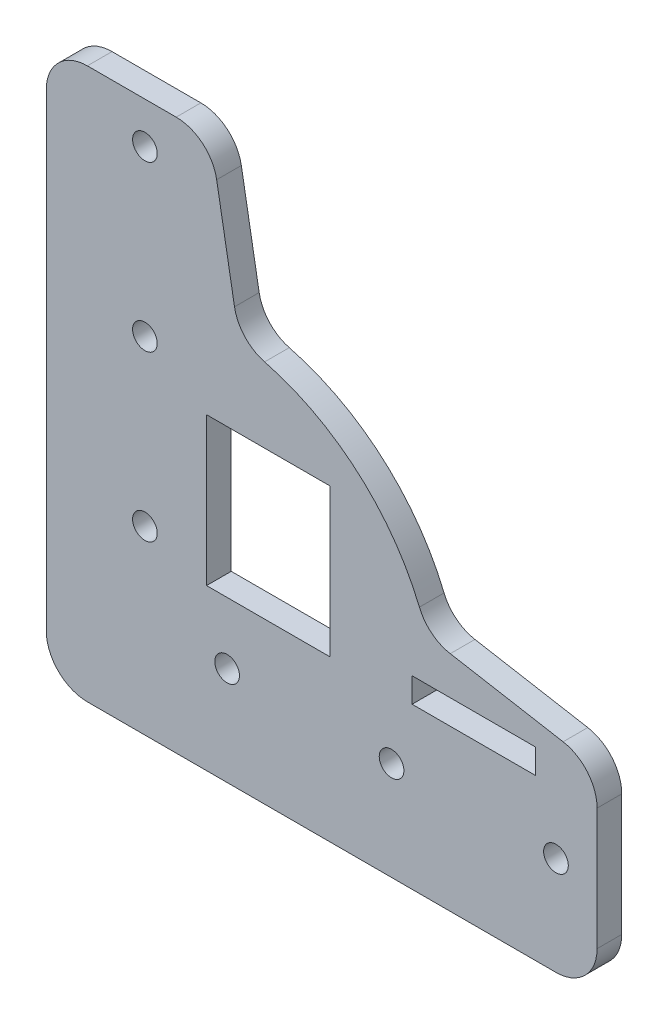
ISO-10303-21;
HEADER;
FILE_DESCRIPTION(('STEP AP214'),'2;1');
FILE_NAME('part.step','',(''),(''),'','','');
FILE_SCHEMA(('AUTOMOTIVE_DESIGN { 1 0 10303 214 1 1 1 1 }'));
ENDSEC;
DATA;
#1=APPLICATION_CONTEXT('core data for automotive mechanical design processes');
#2=APPLICATION_PROTOCOL_DEFINITION('international standard','automotive_design',2000,#1);
#3=PRODUCT_CONTEXT('',#1,'mechanical');
#4=PRODUCT('Part','Part','',(#3));
#5=PRODUCT_RELATED_PRODUCT_CATEGORY('part','',(#4));
#6=PRODUCT_DEFINITION_FORMATION('','',#4);
#7=PRODUCT_DEFINITION_CONTEXT('part definition',#1,'design');
#8=PRODUCT_DEFINITION('design','',#6,#7);
#9=PRODUCT_DEFINITION_SHAPE('','',#8);
#10=(LENGTH_UNIT() NAMED_UNIT(*) SI_UNIT(.MILLI.,.METRE.));
#11=(NAMED_UNIT(*) PLANE_ANGLE_UNIT() SI_UNIT($,.RADIAN.));
#12=(NAMED_UNIT(*) SI_UNIT($,.STERADIAN.) SOLID_ANGLE_UNIT());
#13=UNCERTAINTY_MEASURE_WITH_UNIT(LENGTH_MEASURE(1.E-05),#10,'distance_accuracy_value','');
#14=(GEOMETRIC_REPRESENTATION_CONTEXT(3) GLOBAL_UNCERTAINTY_ASSIGNED_CONTEXT((#13)) GLOBAL_UNIT_ASSIGNED_CONTEXT((#10,
#11,#12)) REPRESENTATION_CONTEXT('',''));
#15=CARTESIAN_POINT('',(0.,0.,0.));
#16=DIRECTION('',(0.,0.,1.));
#17=DIRECTION('',(1.,0.,0.));
#18=AXIS2_PLACEMENT_3D('',#15,#16,#17);
#19=CARTESIAN_POINT('',(27.8219353715967,51.4334525485574,3.));
#20=DIRECTION('',(0.,0.,1.));
#21=DIRECTION('',(1.,0.,0.));
#22=AXIS2_PLACEMENT_3D('',#19,#20,#21);
#23=PLANE('',#22);
#24=CARTESIAN_POINT('',(42.,12.,3.));
#25=DIRECTION('',(0.,0.,1.));
#26=DIRECTION('',(-1.,0.,0.));
#27=AXIS2_PLACEMENT_3D('',#24,#25,#26);
#28=CIRCLE('',#27,1.5);
#29=CARTESIAN_POINT('',(40.5,12.,3.));
#30=VERTEX_POINT('',#29);
#31=EDGE_CURVE('E232',#30,#30,#28,.T.);
#32=ORIENTED_EDGE('',*,*,#31,.F.);
#33=EDGE_LOOP('',(#32));
#34=FACE_BOUND('',#33,.T.);
#35=DIRECTION('',(1.,0.,0.));
#36=VECTOR('',#35,1.);
#37=CARTESIAN_POINT('',(19.5,19.5,3.));
#38=LINE('',#37,#36);
#39=CARTESIAN_POINT('',(19.5,19.5,3.));
#40=VERTEX_POINT('',#39);
#41=CARTESIAN_POINT('',(34.5,19.5,3.));
#42=VERTEX_POINT('',#41);
#43=EDGE_CURVE('E246',#40,#42,#38,.T.);
#44=ORIENTED_EDGE('',*,*,#43,.F.);
#45=DIRECTION('',(0.,-1.,0.));
#46=VECTOR('',#45,1.);
#47=CARTESIAN_POINT('',(19.5,37.5,3.));
#48=LINE('',#47,#46);
#49=CARTESIAN_POINT('',(19.5,37.5,3.));
#50=VERTEX_POINT('',#49);
#51=EDGE_CURVE('E244',#50,#40,#48,.T.);
#52=ORIENTED_EDGE('',*,*,#51,.F.);
#53=DIRECTION('',(-1.,0.,0.));
#54=VECTOR('',#53,1.);
#55=CARTESIAN_POINT('',(19.5,37.5,3.));
#56=LINE('',#55,#54);
#57=CARTESIAN_POINT('',(34.5,37.5,3.));
#58=VERTEX_POINT('',#57);
#59=EDGE_CURVE('E252',#58,#50,#56,.T.);
#60=ORIENTED_EDGE('',*,*,#59,.F.);
#61=DIRECTION('',(0.,1.,0.));
#62=VECTOR('',#61,1.);
#63=CARTESIAN_POINT('',(34.5,37.5,3.));
#64=LINE('',#63,#62);
#65=EDGE_CURVE('E249',#42,#58,#64,.T.);
#66=ORIENTED_EDGE('',*,*,#65,.F.);
#67=EDGE_LOOP('',(#44,#52,#60,#66));
#68=FACE_BOUND('',#67,.T.);
#69=CARTESIAN_POINT('',(12.,22.,3.));
#70=DIRECTION('',(0.,0.,1.));
#71=DIRECTION('',(1.,0.,0.));
#72=AXIS2_PLACEMENT_3D('',#69,#70,#71);
#73=CIRCLE('',#72,1.5);
#74=CARTESIAN_POINT('',(13.5,22.,3.));
#75=VERTEX_POINT('',#74);
#76=EDGE_CURVE('E275',#75,#75,#73,.T.);
#77=ORIENTED_EDGE('',*,*,#76,.F.);
#78=EDGE_LOOP('',(#77));
#79=FACE_BOUND('',#78,.T.);
#80=CARTESIAN_POINT('',(12.,42.,3.));
#81=DIRECTION('',(0.,0.,1.));
#82=DIRECTION('',(1.,0.,0.));
#83=AXIS2_PLACEMENT_3D('',#80,#81,#82);
#84=CIRCLE('',#83,1.5);
#85=CARTESIAN_POINT('',(13.5,42.,3.));
#86=VERTEX_POINT('',#85);
#87=EDGE_CURVE('E287',#86,#86,#84,.T.);
#88=ORIENTED_EDGE('',*,*,#87,.F.);
#89=EDGE_LOOP('',(#88));
#90=FACE_BOUND('',#89,.T.);
#91=DIRECTION('',(0.,-1.,0.));
#92=VECTOR('',#91,1.);
#93=CARTESIAN_POINT('',(0.,0.,3.));
#94=LINE('',#93,#92);
#95=CARTESIAN_POINT('',(0.,62.,3.));
#96=VERTEX_POINT('',#95);
#97=CARTESIAN_POINT('',(0.,5.,3.));
#98=VERTEX_POINT('',#97);
#99=EDGE_CURVE('E312',#96,#98,#94,.T.);
#100=ORIENTED_EDGE('',*,*,#99,.T.);
#101=CARTESIAN_POINT('',(5.,5.,3.));
#102=DIRECTION('',(0.,0.,1.));
#103=DIRECTION('',(1.,0.,0.));
#104=AXIS2_PLACEMENT_3D('',#101,#102,#103);
#105=CIRCLE('',#104,5.);
#106=CARTESIAN_POINT('',(5.,0.,3.));
#107=VERTEX_POINT('',#106);
#108=EDGE_CURVE('E374',#98,#107,#105,.T.);
#109=ORIENTED_EDGE('',*,*,#108,.T.);
#110=DIRECTION('',(1.,0.,0.));
#111=VECTOR('',#110,1.);
#112=CARTESIAN_POINT('',(67.,0.,3.));
#113=LINE('',#112,#111);
#114=CARTESIAN_POINT('',(62.,0.,3.));
#115=VERTEX_POINT('',#114);
#116=EDGE_CURVE('E293',#107,#115,#113,.T.);
#117=ORIENTED_EDGE('',*,*,#116,.T.);
#118=CARTESIAN_POINT('',(62.,5.,3.));
#119=DIRECTION('',(0.,0.,1.));
#120=DIRECTION('',(1.,0.,0.));
#121=AXIS2_PLACEMENT_3D('',#118,#119,#120);
#122=CIRCLE('',#121,5.);
#123=CARTESIAN_POINT('',(67.,5.,3.));
#124=VERTEX_POINT('',#123);
#125=EDGE_CURVE('E372',#115,#124,#122,.T.);
#126=ORIENTED_EDGE('',*,*,#125,.T.);
#127=DIRECTION('',(0.,1.,0.));
#128=VECTOR('',#127,1.);
#129=CARTESIAN_POINT('',(67.,24.,3.));
#130=LINE('',#129,#128);
#131=CARTESIAN_POINT('',(67.,19.8045018441136,3.));
#132=VERTEX_POINT('',#131);
#133=EDGE_CURVE('E296',#124,#132,#130,.T.);
#134=ORIENTED_EDGE('',*,*,#133,.T.);
#135=CARTESIAN_POINT('',(62.,19.8045018441136,3.));
#136=DIRECTION('',(0.,0.,1.));
#137=DIRECTION('',(1.,0.,0.));
#138=AXIS2_PLACEMENT_3D('',#135,#136,#137);
#139=CIRCLE('',#138,5.);
#140=CARTESIAN_POINT('',(62.8682408883347,24.7285406091746,3.));
#141=VERTEX_POINT('',#140);
#142=EDGE_CURVE('E370',#132,#141,#139,.T.);
#143=ORIENTED_EDGE('',*,*,#142,.T.);
#144=DIRECTION('',(-0.984807753012208,0.173648177666931,0.));
#145=VECTOR('',#144,1.);
#146=CARTESIAN_POINT('',(49.1428436302579,27.1486984667156,3.));
#147=LINE('',#146,#145);
#148=CARTESIAN_POINT('',(49.1428436302579,27.1486984667156,3.));
#149=VERTEX_POINT('',#148);
#150=EDGE_CURVE('E300',#141,#149,#147,.T.);
#151=ORIENTED_EDGE('',*,*,#150,.T.);
#152=CARTESIAN_POINT('',(50.0110845185925,32.0727372317766,3.));
#153=DIRECTION('',(0.,0.,-1.));
#154=DIRECTION('',(1.,0.,0.));
#155=AXIS2_PLACEMENT_3D('',#152,#153,#154);
#156=CIRCLE('',#155,5.);
#157=CARTESIAN_POINT('',(45.3881929248664,30.1677770451438,3.));
#158=VERTEX_POINT('',#157);
#159=EDGE_CURVE('E302',#149,#158,#156,.T.);
#160=ORIENTED_EDGE('',*,*,#159,.T.);
#161=CARTESIAN_POINT('',(19.5,19.5,3.));
#162=DIRECTION('',(0.,0.,1.));
#163=DIRECTION('',(-1.,0.,0.));
#164=AXIS2_PLACEMENT_3D('',#161,#162,#163);
#165=CIRCLE('',#164,28.);
#166=CARTESIAN_POINT('',(26.5610360728699,46.5950506472608,3.));
#167=VERTEX_POINT('',#166);
#168=EDGE_CURVE('E304',#158,#167,#165,.T.);
#169=ORIENTED_EDGE('',*,*,#168,.T.);
#170=CARTESIAN_POINT('',(27.8219353715967,51.4334525485574,3.));
#171=DIRECTION('',(0.,0.,-1.));
#172=DIRECTION('',(1.,0.,0.));
#173=AXIS2_PLACEMENT_3D('',#170,#171,#172);
#174=CIRCLE('',#173,5.);
#175=CARTESIAN_POINT('',(22.8978966065356,50.5652116602228,3.));
#176=VERTEX_POINT('',#175);
#177=EDGE_CURVE('E306',#167,#176,#174,.T.);
#178=ORIENTED_EDGE('',*,*,#177,.T.);
#179=DIRECTION('',(-0.173648177666932,0.984807753012208,0.));
#180=VECTOR('',#179,1.);
#181=CARTESIAN_POINT('',(20.,67.,3.));
#182=LINE('',#181,#180);
#183=CARTESIAN_POINT('',(20.7285406091746,62.8682408883347,3.));
#184=VERTEX_POINT('',#183);
#185=EDGE_CURVE('E308',#176,#184,#182,.T.);
#186=ORIENTED_EDGE('',*,*,#185,.T.);
#187=CARTESIAN_POINT('',(15.8045018441136,62.,3.));
#188=DIRECTION('',(0.,0.,1.));
#189=DIRECTION('',(1.,0.,0.));
#190=AXIS2_PLACEMENT_3D('',#187,#188,#189);
#191=CIRCLE('',#190,5.);
#192=CARTESIAN_POINT('',(15.8045018441136,67.,3.));
#193=VERTEX_POINT('',#192);
#194=EDGE_CURVE('E56',#184,#193,#191,.T.);
#195=ORIENTED_EDGE('',*,*,#194,.T.);
#196=DIRECTION('',(-1.,0.,0.));
#197=VECTOR('',#196,1.);
#198=CARTESIAN_POINT('',(0.,67.,3.));
#199=LINE('',#198,#197);
#200=CARTESIAN_POINT('',(5.,67.,3.));
#201=VERTEX_POINT('',#200);
#202=EDGE_CURVE('E310',#193,#201,#199,.T.);
#203=ORIENTED_EDGE('',*,*,#202,.T.);
#204=CARTESIAN_POINT('',(5.,62.,3.));
#205=DIRECTION('',(0.,0.,1.));
#206=DIRECTION('',(1.,0.,0.));
#207=AXIS2_PLACEMENT_3D('',#204,#205,#206);
#208=CIRCLE('',#207,5.);
#209=EDGE_CURVE('E368',#201,#96,#208,.T.);
#210=ORIENTED_EDGE('',*,*,#209,.T.);
#211=EDGE_LOOP('',(#100,#109,#117,#126,#134,#143,#151,#160,#169,#178,#186,#195,#203,#210));
#212=FACE_BOUND('',#211,.T.);
#213=CARTESIAN_POINT('',(12.,62.,3.));
#214=DIRECTION('',(0.,0.,1.));
#215=DIRECTION('',(1.,0.,0.));
#216=AXIS2_PLACEMENT_3D('',#213,#214,#215);
#217=CIRCLE('',#216,1.5);
#218=CARTESIAN_POINT('',(13.5,62.,3.));
#219=VERTEX_POINT('',#218);
#220=EDGE_CURVE('E281',#219,#219,#217,.T.);
#221=ORIENTED_EDGE('',*,*,#220,.F.);
#222=EDGE_LOOP('',(#221));
#223=FACE_BOUND('',#222,.T.);
#224=CARTESIAN_POINT('',(62.,12.,3.));
#225=DIRECTION('',(0.,0.,1.));
#226=DIRECTION('',(-1.,0.,0.));
#227=AXIS2_PLACEMENT_3D('',#224,#225,#226);
#228=CIRCLE('',#227,1.5);
#229=CARTESIAN_POINT('',(60.5,12.,3.));
#230=VERTEX_POINT('',#229);
#231=EDGE_CURVE('E238',#230,#230,#228,.T.);
#232=ORIENTED_EDGE('',*,*,#231,.F.);
#233=EDGE_LOOP('',(#232));
#234=FACE_BOUND('',#233,.T.);
#235=CARTESIAN_POINT('',(22.,12.,3.));
#236=DIRECTION('',(0.,0.,1.));
#237=DIRECTION('',(-1.,0.,0.));
#238=AXIS2_PLACEMENT_3D('',#235,#236,#237);
#239=CIRCLE('',#238,1.5);
#240=CARTESIAN_POINT('',(20.5,12.,3.));
#241=VERTEX_POINT('',#240);
#242=EDGE_CURVE('E226',#241,#241,#239,.T.);
#243=ORIENTED_EDGE('',*,*,#242,.F.);
#244=EDGE_LOOP('',(#243));
#245=FACE_BOUND('',#244,.T.);
#246=DIRECTION('',(1.,0.,0.));
#247=VECTOR('',#246,1.);
#248=CARTESIAN_POINT('',(44.5,19.5,3.));
#249=LINE('',#248,#247);
#250=CARTESIAN_POINT('',(44.5,19.5,3.));
#251=VERTEX_POINT('',#250);
#252=CARTESIAN_POINT('',(59.5,19.5,3.));
#253=VERTEX_POINT('',#252);
#254=EDGE_CURVE('E195',#251,#253,#249,.T.);
#255=ORIENTED_EDGE('',*,*,#254,.F.);
#256=DIRECTION('',(0.,-1.,0.));
#257=VECTOR('',#256,1.);
#258=CARTESIAN_POINT('',(44.5,19.5,3.));
#259=LINE('',#258,#257);
#260=CARTESIAN_POINT('',(44.5,22.5,3.));
#261=VERTEX_POINT('',#260);
#262=EDGE_CURVE('E185',#261,#251,#259,.T.);
#263=ORIENTED_EDGE('',*,*,#262,.F.);
#264=DIRECTION('',(-1.,0.,0.));
#265=VECTOR('',#264,1.);
#266=CARTESIAN_POINT('',(44.5,22.5,3.));
#267=LINE('',#266,#265);
#268=CARTESIAN_POINT('',(59.5,22.5,3.));
#269=VERTEX_POINT('',#268);
#270=EDGE_CURVE('E210',#269,#261,#267,.T.);
#271=ORIENTED_EDGE('',*,*,#270,.F.);
#272=DIRECTION('',(0.,1.,0.));
#273=VECTOR('',#272,1.);
#274=CARTESIAN_POINT('',(59.5,19.5,3.));
#275=LINE('',#274,#273);
#276=EDGE_CURVE('E208',#253,#269,#275,.T.);
#277=ORIENTED_EDGE('',*,*,#276,.F.);
#278=EDGE_LOOP('',(#255,#263,#271,#277));
#279=FACE_BOUND('',#278,.T.);
#280=ADVANCED_FACE('F35',(#34,#68,#79,#90,#212,#223,#234,#245,#279),#23,.T.);
#281=CARTESIAN_POINT('',(27.8219353715967,51.4334525485574,0.));
#282=DIRECTION('',(0.,0.,1.));
#283=DIRECTION('',(1.,0.,0.));
#284=AXIS2_PLACEMENT_3D('',#281,#282,#283);
#285=PLANE('',#284);
#286=CARTESIAN_POINT('',(22.,12.,0.));
#287=DIRECTION('',(0.,0.,1.));
#288=DIRECTION('',(-1.,0.,0.));
#289=AXIS2_PLACEMENT_3D('',#286,#287,#288);
#290=CIRCLE('',#289,1.5);
#291=CARTESIAN_POINT('',(20.5,12.,0.));
#292=VERTEX_POINT('',#291);
#293=EDGE_CURVE('E203',#292,#292,#290,.T.);
#294=ORIENTED_EDGE('',*,*,#293,.T.);
#295=EDGE_LOOP('',(#294));
#296=FACE_BOUND('',#295,.T.);
#297=CARTESIAN_POINT('',(42.,12.,0.));
#298=DIRECTION('',(0.,0.,1.));
#299=DIRECTION('',(-1.,0.,0.));
#300=AXIS2_PLACEMENT_3D('',#297,#298,#299);
#301=CIRCLE('',#300,1.5);
#302=CARTESIAN_POINT('',(40.5,12.,0.));
#303=VERTEX_POINT('',#302);
#304=EDGE_CURVE('E229',#303,#303,#301,.T.);
#305=ORIENTED_EDGE('',*,*,#304,.T.);
#306=EDGE_LOOP('',(#305));
#307=FACE_BOUND('',#306,.T.);
#308=CARTESIAN_POINT('',(62.,12.,0.));
#309=DIRECTION('',(0.,0.,1.));
#310=DIRECTION('',(-1.,0.,0.));
#311=AXIS2_PLACEMENT_3D('',#308,#309,#310);
#312=CIRCLE('',#311,1.5);
#313=CARTESIAN_POINT('',(60.5,12.,0.));
#314=VERTEX_POINT('',#313);
#315=EDGE_CURVE('E235',#314,#314,#312,.T.);
#316=ORIENTED_EDGE('',*,*,#315,.T.);
#317=EDGE_LOOP('',(#316));
#318=FACE_BOUND('',#317,.T.);
#319=DIRECTION('',(0.,-1.,0.));
#320=VECTOR('',#319,1.);
#321=CARTESIAN_POINT('',(19.5,37.5,0.));
#322=LINE('',#321,#320);
#323=CARTESIAN_POINT('',(19.5,37.5,0.));
#324=VERTEX_POINT('',#323);
#325=CARTESIAN_POINT('',(19.5,19.5,0.));
#326=VERTEX_POINT('',#325);
#327=EDGE_CURVE('E241',#324,#326,#322,.T.);
#328=ORIENTED_EDGE('',*,*,#327,.T.);
#329=DIRECTION('',(1.,0.,0.));
#330=VECTOR('',#329,1.);
#331=CARTESIAN_POINT('',(19.5,19.5,0.));
#332=LINE('',#331,#330);
#333=CARTESIAN_POINT('',(34.5,19.5,0.));
#334=VERTEX_POINT('',#333);
#335=EDGE_CURVE('E257',#326,#334,#332,.T.);
#336=ORIENTED_EDGE('',*,*,#335,.T.);
#337=DIRECTION('',(0.,1.,0.));
#338=VECTOR('',#337,1.);
#339=CARTESIAN_POINT('',(34.5,37.5,0.));
#340=LINE('',#339,#338);
#341=CARTESIAN_POINT('',(34.5,37.5,0.));
#342=VERTEX_POINT('',#341);
#343=EDGE_CURVE('E260',#334,#342,#340,.T.);
#344=ORIENTED_EDGE('',*,*,#343,.T.);
#345=DIRECTION('',(-1.,0.,0.));
#346=VECTOR('',#345,1.);
#347=CARTESIAN_POINT('',(19.5,37.5,0.));
#348=LINE('',#347,#346);
#349=EDGE_CURVE('E247',#342,#324,#348,.T.);
#350=ORIENTED_EDGE('',*,*,#349,.T.);
#351=EDGE_LOOP('',(#328,#336,#344,#350));
#352=FACE_BOUND('',#351,.T.);
#353=DIRECTION('',(1.,0.,0.));
#354=VECTOR('',#353,1.);
#355=CARTESIAN_POINT('',(67.,0.,0.));
#356=LINE('',#355,#354);
#357=CARTESIAN_POINT('',(5.,0.,0.));
#358=VERTEX_POINT('',#357);
#359=CARTESIAN_POINT('',(62.,0.,0.));
#360=VERTEX_POINT('',#359);
#361=EDGE_CURVE('E290',#358,#360,#356,.T.);
#362=ORIENTED_EDGE('',*,*,#361,.F.);
#363=CARTESIAN_POINT('',(5.,5.,0.));
#364=DIRECTION('',(0.,0.,1.));
#365=DIRECTION('',(1.,0.,0.));
#366=AXIS2_PLACEMENT_3D('',#363,#364,#365);
#367=CIRCLE('',#366,5.);
#368=CARTESIAN_POINT('',(0.,5.,0.));
#369=VERTEX_POINT('',#368);
#370=EDGE_CURVE('E360',#358,#369,#367,.F.);
#371=ORIENTED_EDGE('',*,*,#370,.T.);
#372=DIRECTION('',(0.,-1.,0.));
#373=VECTOR('',#372,1.);
#374=CARTESIAN_POINT('',(0.,0.,0.));
#375=LINE('',#374,#373);
#376=CARTESIAN_POINT('',(0.,62.,0.));
#377=VERTEX_POINT('',#376);
#378=EDGE_CURVE('E297',#377,#369,#375,.T.);
#379=ORIENTED_EDGE('',*,*,#378,.F.);
#380=CARTESIAN_POINT('',(5.,62.,0.));
#381=DIRECTION('',(0.,0.,1.));
#382=DIRECTION('',(1.,0.,0.));
#383=AXIS2_PLACEMENT_3D('',#380,#381,#382);
#384=CIRCLE('',#383,5.);
#385=CARTESIAN_POINT('',(5.,67.,0.));
#386=VERTEX_POINT('',#385);
#387=EDGE_CURVE('E354',#377,#386,#384,.F.);
#388=ORIENTED_EDGE('',*,*,#387,.T.);
#389=DIRECTION('',(-1.,0.,0.));
#390=VECTOR('',#389,1.);
#391=CARTESIAN_POINT('',(0.,67.,0.));
#392=LINE('',#391,#390);
#393=CARTESIAN_POINT('',(15.8045018441136,67.,0.));
#394=VERTEX_POINT('',#393);
#395=EDGE_CURVE('E332',#394,#386,#392,.T.);
#396=ORIENTED_EDGE('',*,*,#395,.F.);
#397=CARTESIAN_POINT('',(15.8045018441136,62.,0.));
#398=DIRECTION('',(0.,0.,1.));
#399=DIRECTION('',(1.,0.,0.));
#400=AXIS2_PLACEMENT_3D('',#397,#398,#399);
#401=CIRCLE('',#400,5.);
#402=CARTESIAN_POINT('',(20.7285406091746,62.8682408883347,0.));
#403=VERTEX_POINT('',#402);
#404=EDGE_CURVE('E352',#394,#403,#401,.F.);
#405=ORIENTED_EDGE('',*,*,#404,.T.);
#406=DIRECTION('',(-0.173648177666932,0.984807753012208,0.));
#407=VECTOR('',#406,1.);
#408=CARTESIAN_POINT('',(20.,67.,0.));
#409=LINE('',#408,#407);
#410=CARTESIAN_POINT('',(22.8978966065356,50.5652116602228,0.));
#411=VERTEX_POINT('',#410);
#412=EDGE_CURVE('E329',#411,#403,#409,.T.);
#413=ORIENTED_EDGE('',*,*,#412,.F.);
#414=CARTESIAN_POINT('',(27.8219353715967,51.4334525485574,0.));
#415=DIRECTION('',(0.,0.,-1.));
#416=DIRECTION('',(1.,0.,0.));
#417=AXIS2_PLACEMENT_3D('',#414,#415,#416);
#418=CIRCLE('',#417,5.);
#419=CARTESIAN_POINT('',(26.5610360728699,46.5950506472608,0.));
#420=VERTEX_POINT('',#419);
#421=EDGE_CURVE('E327',#420,#411,#418,.T.);
#422=ORIENTED_EDGE('',*,*,#421,.F.);
#423=CARTESIAN_POINT('',(19.5,19.5,0.));
#424=DIRECTION('',(0.,0.,1.));
#425=DIRECTION('',(-1.,0.,0.));
#426=AXIS2_PLACEMENT_3D('',#423,#424,#425);
#427=CIRCLE('',#426,28.);
#428=CARTESIAN_POINT('',(45.3881929248664,30.1677770451438,0.));
#429=VERTEX_POINT('',#428);
#430=EDGE_CURVE('E325',#429,#420,#427,.T.);
#431=ORIENTED_EDGE('',*,*,#430,.F.);
#432=CARTESIAN_POINT('',(50.0110845185925,32.0727372317766,0.));
#433=DIRECTION('',(0.,0.,-1.));
#434=DIRECTION('',(1.,0.,0.));
#435=AXIS2_PLACEMENT_3D('',#432,#433,#434);
#436=CIRCLE('',#435,5.);
#437=CARTESIAN_POINT('',(49.1428436302579,27.1486984667156,0.));
#438=VERTEX_POINT('',#437);
#439=EDGE_CURVE('E323',#438,#429,#436,.T.);
#440=ORIENTED_EDGE('',*,*,#439,.F.);
#441=DIRECTION('',(-0.984807753012208,0.173648177666931,0.));
#442=VECTOR('',#441,1.);
#443=CARTESIAN_POINT('',(49.1428436302579,27.1486984667156,0.));
#444=LINE('',#443,#442);
#445=CARTESIAN_POINT('',(62.8682408883347,24.7285406091746,0.));
#446=VERTEX_POINT('',#445);
#447=EDGE_CURVE('E321',#446,#438,#444,.T.);
#448=ORIENTED_EDGE('',*,*,#447,.F.);
#449=CARTESIAN_POINT('',(62.,19.8045018441136,0.));
#450=DIRECTION('',(0.,0.,1.));
#451=DIRECTION('',(1.,0.,0.));
#452=AXIS2_PLACEMENT_3D('',#449,#450,#451);
#453=CIRCLE('',#452,5.);
#454=CARTESIAN_POINT('',(67.,19.8045018441136,0.));
#455=VERTEX_POINT('',#454);
#456=EDGE_CURVE('E356',#446,#455,#453,.F.);
#457=ORIENTED_EDGE('',*,*,#456,.T.);
#458=DIRECTION('',(0.,1.,0.));
#459=VECTOR('',#458,1.);
#460=CARTESIAN_POINT('',(67.,24.,0.));
#461=LINE('',#460,#459);
#462=CARTESIAN_POINT('',(67.,5.,0.));
#463=VERTEX_POINT('',#462);
#464=EDGE_CURVE('E318',#463,#455,#461,.T.);
#465=ORIENTED_EDGE('',*,*,#464,.F.);
#466=CARTESIAN_POINT('',(62.,5.,0.));
#467=DIRECTION('',(0.,0.,1.));
#468=DIRECTION('',(1.,0.,0.));
#469=AXIS2_PLACEMENT_3D('',#466,#467,#468);
#470=CIRCLE('',#469,5.);
#471=EDGE_CURVE('E358',#463,#360,#470,.F.);
#472=ORIENTED_EDGE('',*,*,#471,.T.);
#473=EDGE_LOOP('',(#362,#371,#379,#388,#396,#405,#413,#422,#431,#440,#448,#457,#465,#472));
#474=FACE_BOUND('',#473,.T.);
#475=CARTESIAN_POINT('',(12.,42.,0.));
#476=DIRECTION('',(0.,0.,1.));
#477=DIRECTION('',(1.,0.,0.));
#478=AXIS2_PLACEMENT_3D('',#475,#476,#477);
#479=CIRCLE('',#478,1.5);
#480=CARTESIAN_POINT('',(13.5,42.,0.));
#481=VERTEX_POINT('',#480);
#482=EDGE_CURVE('E284',#481,#481,#479,.T.);
#483=ORIENTED_EDGE('',*,*,#482,.T.);
#484=EDGE_LOOP('',(#483));
#485=FACE_BOUND('',#484,.T.);
#486=CARTESIAN_POINT('',(12.,62.,0.));
#487=DIRECTION('',(0.,0.,1.));
#488=DIRECTION('',(1.,0.,0.));
#489=AXIS2_PLACEMENT_3D('',#486,#487,#488);
#490=CIRCLE('',#489,1.5);
#491=CARTESIAN_POINT('',(13.5,62.,0.));
#492=VERTEX_POINT('',#491);
#493=EDGE_CURVE('E278',#492,#492,#490,.T.);
#494=ORIENTED_EDGE('',*,*,#493,.T.);
#495=EDGE_LOOP('',(#494));
#496=FACE_BOUND('',#495,.T.);
#497=CARTESIAN_POINT('',(12.,22.,0.));
#498=DIRECTION('',(0.,0.,1.));
#499=DIRECTION('',(1.,0.,0.));
#500=AXIS2_PLACEMENT_3D('',#497,#498,#499);
#501=CIRCLE('',#500,1.5);
#502=CARTESIAN_POINT('',(13.5,22.,0.));
#503=VERTEX_POINT('',#502);
#504=EDGE_CURVE('E274',#503,#503,#501,.T.);
#505=ORIENTED_EDGE('',*,*,#504,.T.);
#506=EDGE_LOOP('',(#505));
#507=FACE_BOUND('',#506,.T.);
#508=DIRECTION('',(0.,-1.,0.));
#509=VECTOR('',#508,1.);
#510=CARTESIAN_POINT('',(44.5,19.5,0.));
#511=LINE('',#510,#509);
#512=CARTESIAN_POINT('',(44.5,22.5,0.));
#513=VERTEX_POINT('',#512);
#514=CARTESIAN_POINT('',(44.5,19.5,0.));
#515=VERTEX_POINT('',#514);
#516=EDGE_CURVE('E214',#513,#515,#511,.T.);
#517=ORIENTED_EDGE('',*,*,#516,.T.);
#518=DIRECTION('',(1.,0.,0.));
#519=VECTOR('',#518,1.);
#520=CARTESIAN_POINT('',(44.5,19.5,0.));
#521=LINE('',#520,#519);
#522=CARTESIAN_POINT('',(59.5,19.5,0.));
#523=VERTEX_POINT('',#522);
#524=EDGE_CURVE('E202',#515,#523,#521,.T.);
#525=ORIENTED_EDGE('',*,*,#524,.T.);
#526=DIRECTION('',(0.,1.,0.));
#527=VECTOR('',#526,1.);
#528=CARTESIAN_POINT('',(59.5,19.5,0.));
#529=LINE('',#528,#527);
#530=CARTESIAN_POINT('',(59.5,22.5,0.));
#531=VERTEX_POINT('',#530);
#532=EDGE_CURVE('E217',#523,#531,#529,.T.);
#533=ORIENTED_EDGE('',*,*,#532,.T.);
#534=DIRECTION('',(-1.,0.,0.));
#535=VECTOR('',#534,1.);
#536=CARTESIAN_POINT('',(44.5,22.5,0.));
#537=LINE('',#536,#535);
#538=EDGE_CURVE('E196',#531,#513,#537,.T.);
#539=ORIENTED_EDGE('',*,*,#538,.T.);
#540=EDGE_LOOP('',(#517,#525,#533,#539));
#541=FACE_BOUND('',#540,.T.);
#542=ADVANCED_FACE('F392',(#296,#307,#318,#352,#474,#485,#496,#507,#541),#285,.F.);
#543=CARTESIAN_POINT('',(67.,0.,3.));
#544=DIRECTION('',(0.,1.,0.));
#545=DIRECTION('',(-1.,0.,0.));
#546=AXIS2_PLACEMENT_3D('',#543,#544,#545);
#547=PLANE('',#546);
#548=ORIENTED_EDGE('',*,*,#116,.F.);
#549=DIRECTION('',(0.,0.,-1.));
#550=VECTOR('',#549,1.);
#551=CARTESIAN_POINT('',(5.,0.,3.));
#552=LINE('',#551,#550);
#553=EDGE_CURVE('E349',#107,#358,#552,.T.);
#554=ORIENTED_EDGE('',*,*,#553,.T.);
#555=ORIENTED_EDGE('',*,*,#361,.T.);
#556=DIRECTION('',(0.,0.,-1.));
#557=VECTOR('',#556,1.);
#558=CARTESIAN_POINT('',(62.,0.,3.));
#559=LINE('',#558,#557);
#560=EDGE_CURVE('E347',#360,#115,#559,.F.);
#561=ORIENTED_EDGE('',*,*,#560,.T.);
#562=EDGE_LOOP('',(#548,#554,#555,#561));
#563=FACE_BOUND('',#562,.T.);
#564=ADVANCED_FACE('F411',(#563),#547,.F.);
#565=CARTESIAN_POINT('',(67.,24.,3.));
#566=DIRECTION('',(-1.,0.,0.));
#567=DIRECTION('',(0.,0.,1.));
#568=AXIS2_PLACEMENT_3D('',#565,#566,#567);
#569=PLANE('',#568);
#570=ORIENTED_EDGE('',*,*,#133,.F.);
#571=DIRECTION('',(0.,0.,-1.));
#572=VECTOR('',#571,1.);
#573=CARTESIAN_POINT('',(67.,5.,3.));
#574=LINE('',#573,#572);
#575=EDGE_CURVE('E378',#124,#463,#574,.T.);
#576=ORIENTED_EDGE('',*,*,#575,.T.);
#577=ORIENTED_EDGE('',*,*,#464,.T.);
#578=DIRECTION('',(0.,0.,-1.));
#579=VECTOR('',#578,1.);
#580=CARTESIAN_POINT('',(67.,19.8045018441136,3.));
#581=LINE('',#580,#579);
#582=EDGE_CURVE('E376',#455,#132,#581,.F.);
#583=ORIENTED_EDGE('',*,*,#582,.T.);
#584=EDGE_LOOP('',(#570,#576,#577,#583));
#585=FACE_BOUND('',#584,.T.);
#586=ADVANCED_FACE('F420',(#585),#569,.F.);
#587=CARTESIAN_POINT('',(49.1428436302579,27.1486984667156,3.));
#588=DIRECTION('',(-0.173648177666931,-0.984807753012208,0.));
#589=DIRECTION('',(0.984807753012208,-0.173648177666931,0.));
#590=AXIS2_PLACEMENT_3D('',#587,#588,#589);
#591=PLANE('',#590);
#592=ORIENTED_EDGE('',*,*,#150,.F.);
#593=DIRECTION('',(0.,0.,-1.));
#594=VECTOR('',#593,1.);
#595=CARTESIAN_POINT('',(62.8682408883347,24.7285406091746,3.));
#596=LINE('',#595,#594);
#597=EDGE_CURVE('E381',#141,#446,#596,.T.);
#598=ORIENTED_EDGE('',*,*,#597,.T.);
#599=ORIENTED_EDGE('',*,*,#447,.T.);
#600=DIRECTION('',(0.,0.,-1.));
#601=VECTOR('',#600,1.);
#602=CARTESIAN_POINT('',(49.1428436302579,27.1486984667156,3.));
#603=LINE('',#602,#601);
#604=EDGE_CURVE('E344',#149,#438,#603,.T.);
#605=ORIENTED_EDGE('',*,*,#604,.F.);
#606=EDGE_LOOP('',(#592,#598,#599,#605));
#607=FACE_BOUND('',#606,.T.);
#608=ADVANCED_FACE('F429',(#607),#591,.F.);
#609=CARTESIAN_POINT('',(50.0110845185925,32.0727372317766,3.));
#610=DIRECTION('',(0.,0.,-1.));
#611=DIRECTION('',(-1.,0.,0.));
#612=AXIS2_PLACEMENT_3D('',#609,#610,#611);
#613=CYLINDRICAL_SURFACE('',#612,5.);
#614=ORIENTED_EDGE('',*,*,#439,.T.);
#615=DIRECTION('',(0.,0.,-1.));
#616=VECTOR('',#615,1.);
#617=CARTESIAN_POINT('',(45.3881929248664,30.1677770451438,3.));
#618=LINE('',#617,#616);
#619=EDGE_CURVE('E341',#158,#429,#618,.T.);
#620=ORIENTED_EDGE('',*,*,#619,.F.);
#621=ORIENTED_EDGE('',*,*,#159,.F.);
#622=ORIENTED_EDGE('',*,*,#604,.T.);
#623=EDGE_LOOP('',(#614,#620,#621,#622));
#624=FACE_BOUND('',#623,.T.);
#625=ADVANCED_FACE('F436',(#624),#613,.F.);
#626=CARTESIAN_POINT('',(19.5,19.5,3.));
#627=DIRECTION('',(0.,0.,-1.));
#628=DIRECTION('',(-1.,0.,0.));
#629=AXIS2_PLACEMENT_3D('',#626,#627,#628);
#630=CYLINDRICAL_SURFACE('',#629,28.);
#631=ORIENTED_EDGE('',*,*,#430,.T.);
#632=DIRECTION('',(0.,0.,-1.));
#633=VECTOR('',#632,1.);
#634=CARTESIAN_POINT('',(26.5610360728699,46.5950506472608,3.));
#635=LINE('',#634,#633);
#636=EDGE_CURVE('E338',#167,#420,#635,.T.);
#637=ORIENTED_EDGE('',*,*,#636,.F.);
#638=ORIENTED_EDGE('',*,*,#168,.F.);
#639=ORIENTED_EDGE('',*,*,#619,.T.);
#640=EDGE_LOOP('',(#631,#637,#638,#639));
#641=FACE_BOUND('',#640,.T.);
#642=ADVANCED_FACE('F440',(#641),#630,.T.);
#643=CARTESIAN_POINT('',(27.8219353715967,51.4334525485574,3.));
#644=DIRECTION('',(0.,0.,-1.));
#645=DIRECTION('',(-1.,0.,0.));
#646=AXIS2_PLACEMENT_3D('',#643,#644,#645);
#647=CYLINDRICAL_SURFACE('',#646,5.);
#648=ORIENTED_EDGE('',*,*,#421,.T.);
#649=DIRECTION('',(0.,0.,-1.));
#650=VECTOR('',#649,1.);
#651=CARTESIAN_POINT('',(22.8978966065356,50.5652116602228,3.));
#652=LINE('',#651,#650);
#653=EDGE_CURVE('E315',#176,#411,#652,.T.);
#654=ORIENTED_EDGE('',*,*,#653,.F.);
#655=ORIENTED_EDGE('',*,*,#177,.F.);
#656=ORIENTED_EDGE('',*,*,#636,.T.);
#657=EDGE_LOOP('',(#648,#654,#655,#656));
#658=FACE_BOUND('',#657,.T.);
#659=ADVANCED_FACE('F446',(#658),#647,.F.);
#660=CARTESIAN_POINT('',(20.,67.,3.));
#661=DIRECTION('',(-0.984807753012208,-0.173648177666931,0.));
#662=DIRECTION('',(0.173648177666932,-0.984807753012208,0.));
#663=AXIS2_PLACEMENT_3D('',#660,#661,#662);
#664=PLANE('',#663);
#665=ORIENTED_EDGE('',*,*,#412,.T.);
#666=DIRECTION('',(0.,0.,-1.));
#667=VECTOR('',#666,1.);
#668=CARTESIAN_POINT('',(20.7285406091746,62.8682408883347,3.));
#669=LINE('',#668,#667);
#670=EDGE_CURVE('E11',#403,#184,#669,.F.);
#671=ORIENTED_EDGE('',*,*,#670,.T.);
#672=ORIENTED_EDGE('',*,*,#185,.F.);
#673=ORIENTED_EDGE('',*,*,#653,.T.);
#674=EDGE_LOOP('',(#665,#671,#672,#673));
#675=FACE_BOUND('',#674,.T.);
#676=ADVANCED_FACE('F448',(#675),#664,.F.);
#677=CARTESIAN_POINT('',(0.,67.,3.));
#678=DIRECTION('',(0.,-1.,0.));
#679=DIRECTION('',(0.,0.,-1.));
#680=AXIS2_PLACEMENT_3D('',#677,#678,#679);
#681=PLANE('',#680);
#682=ORIENTED_EDGE('',*,*,#395,.T.);
#683=DIRECTION('',(0.,0.,-1.));
#684=VECTOR('',#683,1.);
#685=CARTESIAN_POINT('',(5.,67.,3.));
#686=LINE('',#685,#684);
#687=EDGE_CURVE('E43',#386,#201,#686,.F.);
#688=ORIENTED_EDGE('',*,*,#687,.T.);
#689=ORIENTED_EDGE('',*,*,#202,.F.);
#690=DIRECTION('',(0.,0.,-1.));
#691=VECTOR('',#690,1.);
#692=CARTESIAN_POINT('',(15.8045018441136,67.,3.));
#693=LINE('',#692,#691);
#694=EDGE_CURVE('E384',#193,#394,#693,.T.);
#695=ORIENTED_EDGE('',*,*,#694,.T.);
#696=EDGE_LOOP('',(#682,#688,#689,#695));
#697=FACE_BOUND('',#696,.T.);
#698=ADVANCED_FACE('F388',(#697),#681,.F.);
#699=CARTESIAN_POINT('',(0.,0.,3.));
#700=DIRECTION('',(1.,0.,0.));
#701=DIRECTION('',(0.,0.,-1.));
#702=AXIS2_PLACEMENT_3D('',#699,#700,#701);
#703=PLANE('',#702);
#704=ORIENTED_EDGE('',*,*,#378,.T.);
#705=DIRECTION('',(0.,0.,-1.));
#706=VECTOR('',#705,1.);
#707=CARTESIAN_POINT('',(0.,5.,3.));
#708=LINE('',#707,#706);
#709=EDGE_CURVE('E365',#369,#98,#708,.F.);
#710=ORIENTED_EDGE('',*,*,#709,.T.);
#711=ORIENTED_EDGE('',*,*,#99,.F.);
#712=DIRECTION('',(0.,0.,-1.));
#713=VECTOR('',#712,1.);
#714=CARTESIAN_POINT('',(0.,62.,3.));
#715=LINE('',#714,#713);
#716=EDGE_CURVE('E362',#96,#377,#715,.T.);
#717=ORIENTED_EDGE('',*,*,#716,.T.);
#718=EDGE_LOOP('',(#704,#710,#711,#717));
#719=FACE_BOUND('',#718,.T.);
#720=ADVANCED_FACE('F402',(#719),#703,.F.);
#721=CARTESIAN_POINT('',(12.,42.,3.));
#722=DIRECTION('',(0.,0.,-1.));
#723=DIRECTION('',(-1.,0.,0.));
#724=AXIS2_PLACEMENT_3D('',#721,#722,#723);
#725=CYLINDRICAL_SURFACE('',#724,1.5);
#726=ORIENTED_EDGE('',*,*,#87,.T.);
#727=EDGE_LOOP('',(#726));
#728=FACE_BOUND('',#727,.T.);
#729=ORIENTED_EDGE('',*,*,#482,.F.);
#730=EDGE_LOOP('',(#729));
#731=FACE_BOUND('',#730,.T.);
#732=ADVANCED_FACE('F465',(#728,#731),#725,.F.);
#733=CARTESIAN_POINT('',(12.,62.,3.));
#734=DIRECTION('',(0.,0.,-1.));
#735=DIRECTION('',(-1.,0.,0.));
#736=AXIS2_PLACEMENT_3D('',#733,#734,#735);
#737=CYLINDRICAL_SURFACE('',#736,1.5);
#738=ORIENTED_EDGE('',*,*,#220,.T.);
#739=EDGE_LOOP('',(#738));
#740=FACE_BOUND('',#739,.T.);
#741=ORIENTED_EDGE('',*,*,#493,.F.);
#742=EDGE_LOOP('',(#741));
#743=FACE_BOUND('',#742,.T.);
#744=ADVANCED_FACE('F621',(#740,#743),#737,.F.);
#745=CARTESIAN_POINT('',(12.,22.,3.));
#746=DIRECTION('',(0.,0.,-1.));
#747=DIRECTION('',(-1.,0.,0.));
#748=AXIS2_PLACEMENT_3D('',#745,#746,#747);
#749=CYLINDRICAL_SURFACE('',#748,1.5);
#750=ORIENTED_EDGE('',*,*,#76,.T.);
#751=EDGE_LOOP('',(#750));
#752=FACE_BOUND('',#751,.T.);
#753=ORIENTED_EDGE('',*,*,#504,.F.);
#754=EDGE_LOOP('',(#753));
#755=FACE_BOUND('',#754,.T.);
#756=ADVANCED_FACE('F612',(#752,#755),#749,.F.);
#757=CARTESIAN_POINT('',(19.5,37.5,3.));
#758=DIRECTION('',(1.,0.,0.));
#759=DIRECTION('',(0.,1.,0.));
#760=AXIS2_PLACEMENT_3D('',#757,#758,#759);
#761=PLANE('',#760);
#762=ORIENTED_EDGE('',*,*,#327,.F.);
#763=DIRECTION('',(0.,0.,-1.));
#764=VECTOR('',#763,1.);
#765=CARTESIAN_POINT('',(19.5,37.5,3.));
#766=LINE('',#765,#764);
#767=EDGE_CURVE('E254',#50,#324,#766,.T.);
#768=ORIENTED_EDGE('',*,*,#767,.F.);
#769=ORIENTED_EDGE('',*,*,#51,.T.);
#770=DIRECTION('',(0.,0.,-1.));
#771=VECTOR('',#770,1.);
#772=CARTESIAN_POINT('',(19.5,19.5,3.));
#773=LINE('',#772,#771);
#774=EDGE_CURVE('E271',#40,#326,#773,.T.);
#775=ORIENTED_EDGE('',*,*,#774,.T.);
#776=EDGE_LOOP('',(#762,#768,#769,#775));
#777=FACE_BOUND('',#776,.T.);
#778=ADVANCED_FACE('F603',(#777),#761,.T.);
#779=CARTESIAN_POINT('',(19.5,19.5,3.));
#780=DIRECTION('',(0.,1.,0.));
#781=DIRECTION('',(0.,0.,1.));
#782=AXIS2_PLACEMENT_3D('',#779,#780,#781);
#783=PLANE('',#782);
#784=ORIENTED_EDGE('',*,*,#335,.F.);
#785=ORIENTED_EDGE('',*,*,#774,.F.);
#786=ORIENTED_EDGE('',*,*,#43,.T.);
#787=DIRECTION('',(0.,0.,-1.));
#788=VECTOR('',#787,1.);
#789=CARTESIAN_POINT('',(34.5,19.5,3.));
#790=LINE('',#789,#788);
#791=EDGE_CURVE('E269',#42,#334,#790,.T.);
#792=ORIENTED_EDGE('',*,*,#791,.T.);
#793=EDGE_LOOP('',(#784,#785,#786,#792));
#794=FACE_BOUND('',#793,.T.);
#795=ADVANCED_FACE('F594',(#794),#783,.T.);
#796=CARTESIAN_POINT('',(34.5,37.5,3.));
#797=DIRECTION('',(-1.,0.,0.));
#798=DIRECTION('',(0.,-1.,0.));
#799=AXIS2_PLACEMENT_3D('',#796,#797,#798);
#800=PLANE('',#799);
#801=ORIENTED_EDGE('',*,*,#343,.F.);
#802=ORIENTED_EDGE('',*,*,#791,.F.);
#803=ORIENTED_EDGE('',*,*,#65,.T.);
#804=DIRECTION('',(0.,0.,-1.));
#805=VECTOR('',#804,1.);
#806=CARTESIAN_POINT('',(34.5,37.5,3.));
#807=LINE('',#806,#805);
#808=EDGE_CURVE('E267',#58,#342,#807,.T.);
#809=ORIENTED_EDGE('',*,*,#808,.T.);
#810=EDGE_LOOP('',(#801,#802,#803,#809));
#811=FACE_BOUND('',#810,.T.);
#812=ADVANCED_FACE('F585',(#811),#800,.T.);
#813=CARTESIAN_POINT('',(19.5,37.5,3.));
#814=DIRECTION('',(0.,-1.,0.));
#815=DIRECTION('',(1.,0.,0.));
#816=AXIS2_PLACEMENT_3D('',#813,#814,#815);
#817=PLANE('',#816);
#818=ORIENTED_EDGE('',*,*,#349,.F.);
#819=ORIENTED_EDGE('',*,*,#808,.F.);
#820=ORIENTED_EDGE('',*,*,#59,.T.);
#821=ORIENTED_EDGE('',*,*,#767,.T.);
#822=EDGE_LOOP('',(#818,#819,#820,#821));
#823=FACE_BOUND('',#822,.T.);
#824=ADVANCED_FACE('F576',(#823),#817,.T.);
#825=CARTESIAN_POINT('',(62.,12.,3.));
#826=DIRECTION('',(0.,0.,-1.));
#827=DIRECTION('',(-1.,0.,0.));
#828=AXIS2_PLACEMENT_3D('',#825,#826,#827);
#829=CYLINDRICAL_SURFACE('',#828,1.5);
#830=ORIENTED_EDGE('',*,*,#231,.T.);
#831=EDGE_LOOP('',(#830));
#832=FACE_BOUND('',#831,.T.);
#833=ORIENTED_EDGE('',*,*,#315,.F.);
#834=EDGE_LOOP('',(#833));
#835=FACE_BOUND('',#834,.T.);
#836=ADVANCED_FACE('F567',(#832,#835),#829,.F.);
#837=CARTESIAN_POINT('',(42.,12.,3.));
#838=DIRECTION('',(0.,0.,-1.));
#839=DIRECTION('',(-1.,0.,0.));
#840=AXIS2_PLACEMENT_3D('',#837,#838,#839);
#841=CYLINDRICAL_SURFACE('',#840,1.5);
#842=ORIENTED_EDGE('',*,*,#31,.T.);
#843=EDGE_LOOP('',(#842));
#844=FACE_BOUND('',#843,.T.);
#845=ORIENTED_EDGE('',*,*,#304,.F.);
#846=EDGE_LOOP('',(#845));
#847=FACE_BOUND('',#846,.T.);
#848=ADVANCED_FACE('F558',(#844,#847),#841,.F.);
#849=CARTESIAN_POINT('',(22.,12.,3.));
#850=DIRECTION('',(0.,0.,-1.));
#851=DIRECTION('',(-1.,0.,0.));
#852=AXIS2_PLACEMENT_3D('',#849,#850,#851);
#853=CYLINDRICAL_SURFACE('',#852,1.5);
#854=ORIENTED_EDGE('',*,*,#242,.T.);
#855=EDGE_LOOP('',(#854));
#856=FACE_BOUND('',#855,.T.);
#857=ORIENTED_EDGE('',*,*,#293,.F.);
#858=EDGE_LOOP('',(#857));
#859=FACE_BOUND('',#858,.T.);
#860=ADVANCED_FACE('F550',(#856,#859),#853,.F.);
#861=CARTESIAN_POINT('',(44.5,19.5,3.));
#862=DIRECTION('',(1.,0.,0.));
#863=DIRECTION('',(0.,0.,-1.));
#864=AXIS2_PLACEMENT_3D('',#861,#862,#863);
#865=PLANE('',#864);
#866=ORIENTED_EDGE('',*,*,#516,.F.);
#867=DIRECTION('',(0.,0.,-1.));
#868=VECTOR('',#867,1.);
#869=CARTESIAN_POINT('',(44.5,22.5,3.));
#870=LINE('',#869,#868);
#871=EDGE_CURVE('E191',#261,#513,#870,.T.);
#872=ORIENTED_EDGE('',*,*,#871,.F.);
#873=ORIENTED_EDGE('',*,*,#262,.T.);
#874=DIRECTION('',(0.,0.,-1.));
#875=VECTOR('',#874,1.);
#876=CARTESIAN_POINT('',(44.5,19.5,3.));
#877=LINE('',#876,#875);
#878=EDGE_CURVE('E188',#251,#515,#877,.T.);
#879=ORIENTED_EDGE('',*,*,#878,.T.);
#880=EDGE_LOOP('',(#866,#872,#873,#879));
#881=FACE_BOUND('',#880,.T.);
#882=ADVANCED_FACE('F187',(#881),#865,.T.);
#883=CARTESIAN_POINT('',(44.5,19.5,3.));
#884=DIRECTION('',(0.,1.,0.));
#885=DIRECTION('',(-1.,0.,0.));
#886=AXIS2_PLACEMENT_3D('',#883,#884,#885);
#887=PLANE('',#886);
#888=ORIENTED_EDGE('',*,*,#524,.F.);
#889=ORIENTED_EDGE('',*,*,#878,.F.);
#890=ORIENTED_EDGE('',*,*,#254,.T.);
#891=DIRECTION('',(0.,0.,-1.));
#892=VECTOR('',#891,1.);
#893=CARTESIAN_POINT('',(59.5,19.5,3.));
#894=LINE('',#893,#892);
#895=EDGE_CURVE('E204',#253,#523,#894,.T.);
#896=ORIENTED_EDGE('',*,*,#895,.T.);
#897=EDGE_LOOP('',(#888,#889,#890,#896));
#898=FACE_BOUND('',#897,.T.);
#899=ADVANCED_FACE('F199',(#898),#887,.T.);
#900=CARTESIAN_POINT('',(59.5,19.5,3.));
#901=DIRECTION('',(-1.,0.,0.));
#902=DIRECTION('',(0.,0.,1.));
#903=AXIS2_PLACEMENT_3D('',#900,#901,#902);
#904=PLANE('',#903);
#905=ORIENTED_EDGE('',*,*,#532,.F.);
#906=ORIENTED_EDGE('',*,*,#895,.F.);
#907=ORIENTED_EDGE('',*,*,#276,.T.);
#908=DIRECTION('',(0.,0.,-1.));
#909=VECTOR('',#908,1.);
#910=CARTESIAN_POINT('',(59.5,22.5,3.));
#911=LINE('',#910,#909);
#912=EDGE_CURVE('E223',#269,#531,#911,.T.);
#913=ORIENTED_EDGE('',*,*,#912,.T.);
#914=EDGE_LOOP('',(#905,#906,#907,#913));
#915=FACE_BOUND('',#914,.T.);
#916=ADVANCED_FACE('F526',(#915),#904,.T.);
#917=CARTESIAN_POINT('',(44.5,22.5,3.));
#918=DIRECTION('',(0.,-1.,0.));
#919=DIRECTION('',(1.,0.,0.));
#920=AXIS2_PLACEMENT_3D('',#917,#918,#919);
#921=PLANE('',#920);
#922=ORIENTED_EDGE('',*,*,#538,.F.);
#923=ORIENTED_EDGE('',*,*,#912,.F.);
#924=ORIENTED_EDGE('',*,*,#270,.T.);
#925=ORIENTED_EDGE('',*,*,#871,.T.);
#926=EDGE_LOOP('',(#922,#923,#924,#925));
#927=FACE_BOUND('',#926,.T.);
#928=ADVANCED_FACE('F488',(#927),#921,.T.);
#929=CARTESIAN_POINT('',(5.,5.,3.));
#930=DIRECTION('',(0.,0.,-1.));
#931=DIRECTION('',(-1.,0.,0.));
#932=AXIS2_PLACEMENT_3D('',#929,#930,#931);
#933=CYLINDRICAL_SURFACE('',#932,5.);
#934=ORIENTED_EDGE('',*,*,#108,.F.);
#935=ORIENTED_EDGE('',*,*,#709,.F.);
#936=ORIENTED_EDGE('',*,*,#370,.F.);
#937=ORIENTED_EDGE('',*,*,#553,.F.);
#938=EDGE_LOOP('',(#934,#935,#936,#937));
#939=FACE_BOUND('',#938,.T.);
#940=ADVANCED_FACE('F409',(#939),#933,.T.);
#941=CARTESIAN_POINT('',(62.,5.,3.));
#942=DIRECTION('',(0.,0.,-1.));
#943=DIRECTION('',(-1.,0.,0.));
#944=AXIS2_PLACEMENT_3D('',#941,#942,#943);
#945=CYLINDRICAL_SURFACE('',#944,5.);
#946=ORIENTED_EDGE('',*,*,#125,.F.);
#947=ORIENTED_EDGE('',*,*,#560,.F.);
#948=ORIENTED_EDGE('',*,*,#471,.F.);
#949=ORIENTED_EDGE('',*,*,#575,.F.);
#950=EDGE_LOOP('',(#946,#947,#948,#949));
#951=FACE_BOUND('',#950,.T.);
#952=ADVANCED_FACE('F417',(#951),#945,.T.);
#953=CARTESIAN_POINT('',(62.,19.8045018441136,3.));
#954=DIRECTION('',(0.,0.,-1.));
#955=DIRECTION('',(-1.,0.,0.));
#956=AXIS2_PLACEMENT_3D('',#953,#954,#955);
#957=CYLINDRICAL_SURFACE('',#956,5.);
#958=ORIENTED_EDGE('',*,*,#142,.F.);
#959=ORIENTED_EDGE('',*,*,#582,.F.);
#960=ORIENTED_EDGE('',*,*,#456,.F.);
#961=ORIENTED_EDGE('',*,*,#597,.F.);
#962=EDGE_LOOP('',(#958,#959,#960,#961));
#963=FACE_BOUND('',#962,.T.);
#964=ADVANCED_FACE('F426',(#963),#957,.T.);
#965=CARTESIAN_POINT('',(5.,62.,3.));
#966=DIRECTION('',(0.,0.,-1.));
#967=DIRECTION('',(-1.,0.,0.));
#968=AXIS2_PLACEMENT_3D('',#965,#966,#967);
#969=CYLINDRICAL_SURFACE('',#968,5.);
#970=ORIENTED_EDGE('',*,*,#209,.F.);
#971=ORIENTED_EDGE('',*,*,#687,.F.);
#972=ORIENTED_EDGE('',*,*,#387,.F.);
#973=ORIENTED_EDGE('',*,*,#716,.F.);
#974=EDGE_LOOP('',(#970,#971,#972,#973));
#975=FACE_BOUND('',#974,.T.);
#976=ADVANCED_FACE('F399',(#975),#969,.T.);
#977=CARTESIAN_POINT('',(15.8045018441136,62.,3.));
#978=DIRECTION('',(0.,0.,-1.));
#979=DIRECTION('',(-1.,0.,0.));
#980=AXIS2_PLACEMENT_3D('',#977,#978,#979);
#981=CYLINDRICAL_SURFACE('',#980,5.);
#982=ORIENTED_EDGE('',*,*,#194,.F.);
#983=ORIENTED_EDGE('',*,*,#670,.F.);
#984=ORIENTED_EDGE('',*,*,#404,.F.);
#985=ORIENTED_EDGE('',*,*,#694,.F.);
#986=EDGE_LOOP('',(#982,#983,#984,#985));
#987=FACE_BOUND('',#986,.T.);
#988=ADVANCED_FACE('F37',(#987),#981,.T.);
#989=CLOSED_SHELL('',(#280,#542,#564,#586,#608,#625,#642,#659,#676,#698,#720,#732,#744,#756,
#778,#795,#812,#824,#836,#848,#860,#882,#899,#916,#928,#940,#952,#964,#976,#988));
#990=MANIFOLD_SOLID_BREP('B2',#989);
#991=ADVANCED_BREP_SHAPE_REPRESENTATION('',(#18,#990),#14);
#992=SHAPE_DEFINITION_REPRESENTATION(#9,#991);
ENDSEC;
END-ISO-10303-21;
